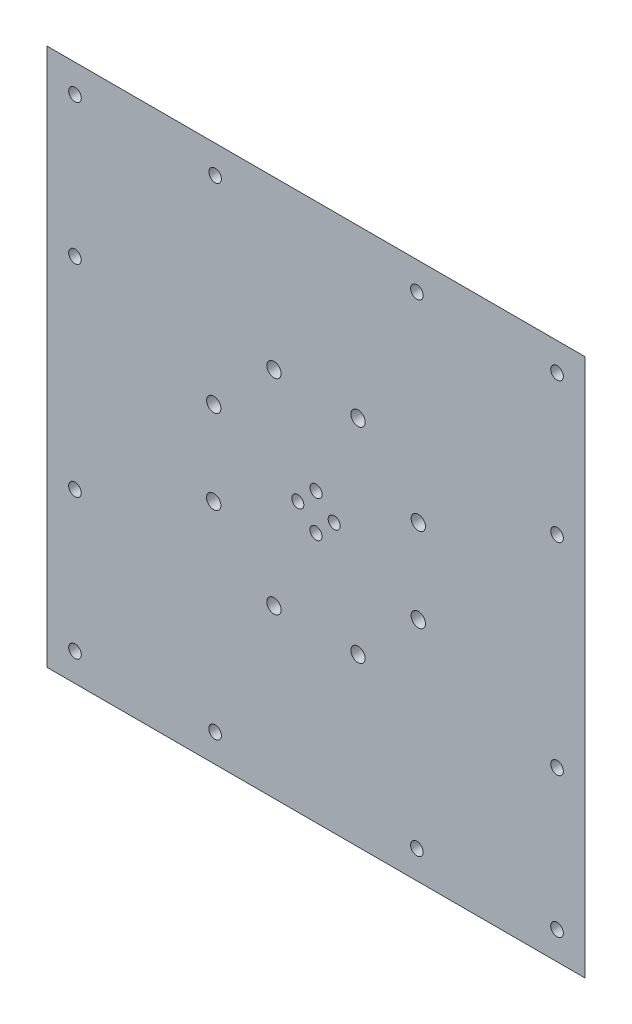
ISO-10303-21;
HEADER;
FILE_DESCRIPTION(('STEP AP214'),'2;1');
FILE_NAME('part.step','',(''),(''),'','','');
FILE_SCHEMA(('AUTOMOTIVE_DESIGN { 1 0 10303 214 1 1 1 1 }'));
ENDSEC;
DATA;
#1=APPLICATION_CONTEXT('core data for automotive mechanical design processes');
#2=APPLICATION_PROTOCOL_DEFINITION('international standard','automotive_design',2000,#1);
#3=PRODUCT_CONTEXT('',#1,'mechanical');
#4=PRODUCT('Part','Part','',(#3));
#5=PRODUCT_RELATED_PRODUCT_CATEGORY('part','',(#4));
#6=PRODUCT_DEFINITION_FORMATION('','',#4);
#7=PRODUCT_DEFINITION_CONTEXT('part definition',#1,'design');
#8=PRODUCT_DEFINITION('design','',#6,#7);
#9=PRODUCT_DEFINITION_SHAPE('','',#8);
#10=(LENGTH_UNIT() NAMED_UNIT(*) SI_UNIT(.MILLI.,.METRE.));
#11=(NAMED_UNIT(*) PLANE_ANGLE_UNIT() SI_UNIT($,.RADIAN.));
#12=(NAMED_UNIT(*) SI_UNIT($,.STERADIAN.) SOLID_ANGLE_UNIT());
#13=UNCERTAINTY_MEASURE_WITH_UNIT(LENGTH_MEASURE(1.E-05),#10,'distance_accuracy_value','');
#14=(GEOMETRIC_REPRESENTATION_CONTEXT(3) GLOBAL_UNCERTAINTY_ASSIGNED_CONTEXT((#13)) GLOBAL_UNIT_ASSIGNED_CONTEXT((#10,
#11,#12)) REPRESENTATION_CONTEXT('',''));
#15=CARTESIAN_POINT('',(0.,0.,0.));
#16=DIRECTION('',(0.,0.,1.));
#17=DIRECTION('',(1.,0.,0.));
#18=AXIS2_PLACEMENT_3D('',#15,#16,#17);
#19=CARTESIAN_POINT('',(0.,0.,0.));
#20=DIRECTION('',(0.,0.,1.));
#21=DIRECTION('',(1.,0.,0.));
#22=AXIS2_PLACEMENT_3D('',#19,#20,#21);
#23=PLANE('',#22);
#24=CARTESIAN_POINT('',(-85.9999999999999,-85.9999999999999,0.));
#25=DIRECTION('',(0.,0.,1.));
#26=DIRECTION('',(1.,0.,0.));
#27=AXIS2_PLACEMENT_3D('',#24,#25,#26);
#28=CIRCLE('',#27,2.24999999999999);
#29=CARTESIAN_POINT('',(-83.7499999999999,-85.9999999999999,0.));
#30=VERTEX_POINT('',#29);
#31=EDGE_CURVE('E641',#30,#30,#28,.T.);
#32=ORIENTED_EDGE('',*,*,#31,.T.);
#33=EDGE_LOOP('',(#32));
#34=FACE_BOUND('',#33,.T.);
#35=CARTESIAN_POINT('',(-85.9999999999999,85.9999999999999,0.));
#36=DIRECTION('',(0.,0.,1.));
#37=DIRECTION('',(1.,0.,0.));
#38=AXIS2_PLACEMENT_3D('',#35,#36,#37);
#39=CIRCLE('',#38,2.24999999999999);
#40=CARTESIAN_POINT('',(-83.7499999999999,85.9999999999999,0.));
#41=VERTEX_POINT('',#40);
#42=EDGE_CURVE('E654',#41,#41,#39,.T.);
#43=ORIENTED_EDGE('',*,*,#42,.T.);
#44=EDGE_LOOP('',(#43));
#45=FACE_BOUND('',#44,.T.);
#46=CARTESIAN_POINT('',(85.9999999999999,85.9999999999999,0.));
#47=DIRECTION('',(0.,0.,1.));
#48=DIRECTION('',(1.,0.,0.));
#49=AXIS2_PLACEMENT_3D('',#46,#47,#48);
#50=CIRCLE('',#49,2.24999999999999);
#51=CARTESIAN_POINT('',(88.2499999999999,85.9999999999999,0.));
#52=VERTEX_POINT('',#51);
#53=EDGE_CURVE('E662',#52,#52,#50,.T.);
#54=ORIENTED_EDGE('',*,*,#53,.T.);
#55=EDGE_LOOP('',(#54));
#56=FACE_BOUND('',#55,.T.);
#57=CARTESIAN_POINT('',(85.9999999999999,-85.9999999999999,0.));
#58=DIRECTION('',(0.,0.,1.));
#59=DIRECTION('',(1.,0.,0.));
#60=AXIS2_PLACEMENT_3D('',#57,#58,#59);
#61=CIRCLE('',#60,2.24999999999999);
#62=CARTESIAN_POINT('',(88.2499999999999,-85.9999999999999,0.));
#63=VERTEX_POINT('',#62);
#64=EDGE_CURVE('E670',#63,#63,#61,.T.);
#65=ORIENTED_EDGE('',*,*,#64,.T.);
#66=EDGE_LOOP('',(#65));
#67=FACE_BOUND('',#66,.T.);
#68=CARTESIAN_POINT('',(-85.9999999999999,-35.9999999999999,0.));
#69=DIRECTION('',(0.,0.,1.));
#70=DIRECTION('',(1.,0.,0.));
#71=AXIS2_PLACEMENT_3D('',#68,#69,#70);
#72=CIRCLE('',#71,2.24999999999999);
#73=CARTESIAN_POINT('',(-83.7499999999999,-35.9999999999999,0.));
#74=VERTEX_POINT('',#73);
#75=EDGE_CURVE('E678',#74,#74,#72,.T.);
#76=ORIENTED_EDGE('',*,*,#75,.T.);
#77=EDGE_LOOP('',(#76));
#78=FACE_BOUND('',#77,.T.);
#79=CARTESIAN_POINT('',(-35.9999999999999,-85.9999999999999,0.));
#80=DIRECTION('',(0.,0.,1.));
#81=DIRECTION('',(1.,0.,0.));
#82=AXIS2_PLACEMENT_3D('',#79,#80,#81);
#83=CIRCLE('',#82,2.24999999999999);
#84=CARTESIAN_POINT('',(-33.7499999999999,-85.9999999999999,0.));
#85=VERTEX_POINT('',#84);
#86=EDGE_CURVE('E686',#85,#85,#83,.T.);
#87=ORIENTED_EDGE('',*,*,#86,.T.);
#88=EDGE_LOOP('',(#87));
#89=FACE_BOUND('',#88,.T.);
#90=CARTESIAN_POINT('',(35.9999999999999,-85.9999999999999,0.));
#91=DIRECTION('',(0.,0.,1.));
#92=DIRECTION('',(1.,0.,0.));
#93=AXIS2_PLACEMENT_3D('',#90,#91,#92);
#94=CIRCLE('',#93,2.24999999999999);
#95=CARTESIAN_POINT('',(38.2499999999999,-85.9999999999999,0.));
#96=VERTEX_POINT('',#95);
#97=EDGE_CURVE('E694',#96,#96,#94,.T.);
#98=ORIENTED_EDGE('',*,*,#97,.T.);
#99=EDGE_LOOP('',(#98));
#100=FACE_BOUND('',#99,.T.);
#101=CARTESIAN_POINT('',(85.9999999999999,-35.9999999999999,0.));
#102=DIRECTION('',(0.,0.,1.));
#103=DIRECTION('',(1.,0.,0.));
#104=AXIS2_PLACEMENT_3D('',#101,#102,#103);
#105=CIRCLE('',#104,2.24999999999999);
#106=CARTESIAN_POINT('',(88.2499999999999,-35.9999999999999,0.));
#107=VERTEX_POINT('',#106);
#108=EDGE_CURVE('E702',#107,#107,#105,.T.);
#109=ORIENTED_EDGE('',*,*,#108,.T.);
#110=EDGE_LOOP('',(#109));
#111=FACE_BOUND('',#110,.T.);
#112=CARTESIAN_POINT('',(85.9999999999999,35.9999999999999,0.));
#113=DIRECTION('',(0.,0.,1.));
#114=DIRECTION('',(1.,0.,0.));
#115=AXIS2_PLACEMENT_3D('',#112,#113,#114);
#116=CIRCLE('',#115,2.24999999999999);
#117=CARTESIAN_POINT('',(88.2499999999999,35.9999999999999,0.));
#118=VERTEX_POINT('',#117);
#119=EDGE_CURVE('E710',#118,#118,#116,.T.);
#120=ORIENTED_EDGE('',*,*,#119,.T.);
#121=EDGE_LOOP('',(#120));
#122=FACE_BOUND('',#121,.T.);
#123=CARTESIAN_POINT('',(-35.9999999999999,85.9999999999999,0.));
#124=DIRECTION('',(0.,0.,1.));
#125=DIRECTION('',(1.,0.,0.));
#126=AXIS2_PLACEMENT_3D('',#123,#124,#125);
#127=CIRCLE('',#126,2.24999999999999);
#128=CARTESIAN_POINT('',(-33.7499999999999,85.9999999999999,0.));
#129=VERTEX_POINT('',#128);
#130=EDGE_CURVE('E718',#129,#129,#127,.T.);
#131=ORIENTED_EDGE('',*,*,#130,.T.);
#132=EDGE_LOOP('',(#131));
#133=FACE_BOUND('',#132,.T.);
#134=CARTESIAN_POINT('',(35.9999999999999,85.9999999999999,0.));
#135=DIRECTION('',(0.,0.,1.));
#136=DIRECTION('',(1.,0.,0.));
#137=AXIS2_PLACEMENT_3D('',#134,#135,#136);
#138=CIRCLE('',#137,2.24999999999999);
#139=CARTESIAN_POINT('',(38.2499999999999,85.9999999999999,0.));
#140=VERTEX_POINT('',#139);
#141=EDGE_CURVE('E726',#140,#140,#138,.T.);
#142=ORIENTED_EDGE('',*,*,#141,.T.);
#143=EDGE_LOOP('',(#142));
#144=FACE_BOUND('',#143,.T.);
#145=CARTESIAN_POINT('',(-85.9999999999999,35.9999999999999,0.));
#146=DIRECTION('',(0.,0.,1.));
#147=DIRECTION('',(1.,0.,0.));
#148=AXIS2_PLACEMENT_3D('',#145,#146,#147);
#149=CIRCLE('',#148,2.24999999999999);
#150=CARTESIAN_POINT('',(-83.7499999999999,35.9999999999999,0.));
#151=VERTEX_POINT('',#150);
#152=EDGE_CURVE('E96',#151,#151,#149,.T.);
#153=ORIENTED_EDGE('',*,*,#152,.T.);
#154=EDGE_LOOP('',(#153));
#155=FACE_BOUND('',#154,.T.);
#156=DIRECTION('',(0.,1.,0.));
#157=VECTOR('',#156,1.);
#158=CARTESIAN_POINT('',(-89.9999999999998,0.,0.));
#159=LINE('',#158,#157);
#160=CARTESIAN_POINT('',(-89.9999999999998,-89.9999999999998,0.));
#161=VERTEX_POINT('',#160);
#162=CARTESIAN_POINT('',(-89.9999999999998,89.9999999999998,0.));
#163=VERTEX_POINT('',#162);
#164=EDGE_CURVE('E111',#161,#163,#159,.T.);
#165=ORIENTED_EDGE('',*,*,#164,.T.);
#166=DIRECTION('',(1.,0.,0.));
#167=VECTOR('',#166,1.);
#168=CARTESIAN_POINT('',(100.,89.9999999999998,0.));
#169=LINE('',#168,#167);
#170=CARTESIAN_POINT('',(89.9999999999998,89.9999999999998,0.));
#171=VERTEX_POINT('',#170);
#172=EDGE_CURVE('E92',#163,#171,#169,.T.);
#173=ORIENTED_EDGE('',*,*,#172,.T.);
#174=DIRECTION('',(0.,-1.,0.));
#175=VECTOR('',#174,1.);
#176=CARTESIAN_POINT('',(89.9999999999999,-100.,0.));
#177=LINE('',#176,#175);
#178=CARTESIAN_POINT('',(89.9999999999999,-89.9999999999998,0.));
#179=VERTEX_POINT('',#178);
#180=EDGE_CURVE('E99',#171,#179,#177,.T.);
#181=ORIENTED_EDGE('',*,*,#180,.T.);
#182=DIRECTION('',(-1.,0.,0.));
#183=VECTOR('',#182,1.);
#184=CARTESIAN_POINT('',(0.,-89.9999999999998,0.));
#185=LINE('',#184,#183);
#186=EDGE_CURVE('E106',#179,#161,#185,.T.);
#187=ORIENTED_EDGE('',*,*,#186,.T.);
#188=EDGE_LOOP('',(#165,#173,#181,#187));
#189=FACE_BOUND('',#188,.T.);
#190=CARTESIAN_POINT('',(0.,6.50000000000001,0.));
#191=DIRECTION('',(0.,0.,1.));
#192=DIRECTION('',(1.,0.,0.));
#193=AXIS2_PLACEMENT_3D('',#190,#191,#192);
#194=CIRCLE('',#193,2.15);
#195=CARTESIAN_POINT('',(2.15,6.50000000000001,0.));
#196=VERTEX_POINT('',#195);
#197=EDGE_CURVE('E154',#196,#196,#194,.T.);
#198=ORIENTED_EDGE('',*,*,#197,.T.);
#199=EDGE_LOOP('',(#198));
#200=FACE_BOUND('',#199,.T.);
#201=CARTESIAN_POINT('',(36.5,-15.,0.));
#202=DIRECTION('',(0.,0.,1.));
#203=DIRECTION('',(1.,0.,0.));
#204=AXIS2_PLACEMENT_3D('',#201,#202,#203);
#205=CIRCLE('',#204,2.55);
#206=CARTESIAN_POINT('',(39.05,-15.,0.));
#207=VERTEX_POINT('',#206);
#208=EDGE_CURVE('E149',#207,#207,#205,.T.);
#209=ORIENTED_EDGE('',*,*,#208,.T.);
#210=EDGE_LOOP('',(#209));
#211=FACE_BOUND('',#210,.T.);
#212=CARTESIAN_POINT('',(36.5,15.,0.));
#213=DIRECTION('',(0.,0.,1.));
#214=DIRECTION('',(1.,0.,0.));
#215=AXIS2_PLACEMENT_3D('',#212,#213,#214);
#216=CIRCLE('',#215,2.55);
#217=CARTESIAN_POINT('',(39.05,15.,0.));
#218=VERTEX_POINT('',#217);
#219=EDGE_CURVE('E145',#218,#218,#216,.T.);
#220=ORIENTED_EDGE('',*,*,#219,.T.);
#221=EDGE_LOOP('',(#220));
#222=FACE_BOUND('',#221,.T.);
#223=CARTESIAN_POINT('',(6.50000000000001,0.,0.));
#224=DIRECTION('',(0.,0.,1.));
#225=DIRECTION('',(1.,0.,0.));
#226=AXIS2_PLACEMENT_3D('',#223,#224,#225);
#227=CIRCLE('',#226,2.15);
#228=CARTESIAN_POINT('',(8.65000000000001,0.,0.));
#229=VERTEX_POINT('',#228);
#230=EDGE_CURVE('E150',#229,#229,#227,.T.);
#231=ORIENTED_EDGE('',*,*,#230,.T.);
#232=EDGE_LOOP('',(#231));
#233=FACE_BOUND('',#232,.T.);
#234=CARTESIAN_POINT('',(-15.,36.5,0.));
#235=DIRECTION('',(0.,0.,1.));
#236=DIRECTION('',(1.,0.,0.));
#237=AXIS2_PLACEMENT_3D('',#234,#235,#236);
#238=CIRCLE('',#237,2.55);
#239=CARTESIAN_POINT('',(-12.45,36.5,0.));
#240=VERTEX_POINT('',#239);
#241=EDGE_CURVE('E158',#240,#240,#238,.T.);
#242=ORIENTED_EDGE('',*,*,#241,.T.);
#243=EDGE_LOOP('',(#242));
#244=FACE_BOUND('',#243,.T.);
#245=CARTESIAN_POINT('',(15.,36.5,0.));
#246=DIRECTION('',(0.,0.,1.));
#247=DIRECTION('',(1.,0.,0.));
#248=AXIS2_PLACEMENT_3D('',#245,#246,#247);
#249=CIRCLE('',#248,2.55);
#250=CARTESIAN_POINT('',(17.55,36.5,0.));
#251=VERTEX_POINT('',#250);
#252=EDGE_CURVE('E171',#251,#251,#249,.T.);
#253=ORIENTED_EDGE('',*,*,#252,.T.);
#254=EDGE_LOOP('',(#253));
#255=FACE_BOUND('',#254,.T.);
#256=CARTESIAN_POINT('',(-6.50000000000001,0.,0.));
#257=DIRECTION('',(0.,0.,1.));
#258=DIRECTION('',(1.,0.,0.));
#259=AXIS2_PLACEMENT_3D('',#256,#257,#258);
#260=CIRCLE('',#259,2.15);
#261=CARTESIAN_POINT('',(-4.35000000000001,0.,0.));
#262=VERTEX_POINT('',#261);
#263=EDGE_CURVE('E167',#262,#262,#260,.T.);
#264=ORIENTED_EDGE('',*,*,#263,.T.);
#265=EDGE_LOOP('',(#264));
#266=FACE_BOUND('',#265,.T.);
#267=CARTESIAN_POINT('',(-36.5,-15.,0.));
#268=DIRECTION('',(0.,0.,1.));
#269=DIRECTION('',(1.,0.,0.));
#270=AXIS2_PLACEMENT_3D('',#267,#268,#269);
#271=CIRCLE('',#270,2.55);
#272=CARTESIAN_POINT('',(-33.95,-15.,0.));
#273=VERTEX_POINT('',#272);
#274=EDGE_CURVE('E162',#273,#273,#271,.T.);
#275=ORIENTED_EDGE('',*,*,#274,.T.);
#276=EDGE_LOOP('',(#275));
#277=FACE_BOUND('',#276,.T.);
#278=CARTESIAN_POINT('',(-15.,-36.5,0.));
#279=DIRECTION('',(0.,0.,1.));
#280=DIRECTION('',(1.,0.,0.));
#281=AXIS2_PLACEMENT_3D('',#278,#279,#280);
#282=CIRCLE('',#281,2.55);
#283=CARTESIAN_POINT('',(-12.45,-36.5,0.));
#284=VERTEX_POINT('',#283);
#285=EDGE_CURVE('E141',#284,#284,#282,.T.);
#286=ORIENTED_EDGE('',*,*,#285,.T.);
#287=EDGE_LOOP('',(#286));
#288=FACE_BOUND('',#287,.T.);
#289=CARTESIAN_POINT('',(15.,-36.5,0.));
#290=DIRECTION('',(0.,0.,1.));
#291=DIRECTION('',(1.,0.,0.));
#292=AXIS2_PLACEMENT_3D('',#289,#290,#291);
#293=CIRCLE('',#292,2.55);
#294=CARTESIAN_POINT('',(17.55,-36.5,0.));
#295=VERTEX_POINT('',#294);
#296=EDGE_CURVE('E135',#295,#295,#293,.T.);
#297=ORIENTED_EDGE('',*,*,#296,.T.);
#298=EDGE_LOOP('',(#297));
#299=FACE_BOUND('',#298,.T.);
#300=CARTESIAN_POINT('',(0.,-6.50000000000001,0.));
#301=DIRECTION('',(0.,0.,1.));
#302=DIRECTION('',(1.,0.,0.));
#303=AXIS2_PLACEMENT_3D('',#300,#301,#302);
#304=CIRCLE('',#303,2.15);
#305=CARTESIAN_POINT('',(2.15,-6.50000000000001,0.));
#306=VERTEX_POINT('',#305);
#307=EDGE_CURVE('E130',#306,#306,#304,.T.);
#308=ORIENTED_EDGE('',*,*,#307,.T.);
#309=EDGE_LOOP('',(#308));
#310=FACE_BOUND('',#309,.T.);
#311=CARTESIAN_POINT('',(-36.5,15.,0.));
#312=DIRECTION('',(0.,0.,1.));
#313=DIRECTION('',(1.,0.,0.));
#314=AXIS2_PLACEMENT_3D('',#311,#312,#313);
#315=CIRCLE('',#314,2.55);
#316=CARTESIAN_POINT('',(-33.95,15.,0.));
#317=VERTEX_POINT('',#316);
#318=EDGE_CURVE('E166',#317,#317,#315,.T.);
#319=ORIENTED_EDGE('',*,*,#318,.T.);
#320=EDGE_LOOP('',(#319));
#321=FACE_BOUND('',#320,.T.);
#322=ADVANCED_FACE('F45',(#34,#45,#56,#67,#78,#89,#100,#111,#122,#133,#144,#155,#189,#200,#211,
#222,#233,#244,#255,#266,#277,#288,#299,#310,#321),#23,.F.);
#323=CARTESIAN_POINT('',(0.,0.,6.));
#324=DIRECTION('',(0.,0.,1.));
#325=DIRECTION('',(1.,0.,0.));
#326=AXIS2_PLACEMENT_3D('',#323,#324,#325);
#327=PLANE('',#326);
#328=CARTESIAN_POINT('',(-85.9999999999999,-85.9999999999999,6.));
#329=DIRECTION('',(0.,0.,1.));
#330=DIRECTION('',(1.,0.,0.));
#331=AXIS2_PLACEMENT_3D('',#328,#329,#330);
#332=CIRCLE('',#331,2.24999999999999);
#333=CARTESIAN_POINT('',(-83.7499999999999,-85.9999999999999,6.));
#334=VERTEX_POINT('',#333);
#335=EDGE_CURVE('E644',#334,#334,#332,.T.);
#336=ORIENTED_EDGE('',*,*,#335,.F.);
#337=EDGE_LOOP('',(#336));
#338=FACE_BOUND('',#337,.T.);
#339=CARTESIAN_POINT('',(-85.9999999999999,85.9999999999999,6.));
#340=DIRECTION('',(0.,0.,1.));
#341=DIRECTION('',(1.,0.,0.));
#342=AXIS2_PLACEMENT_3D('',#339,#340,#341);
#343=CIRCLE('',#342,2.24999999999999);
#344=CARTESIAN_POINT('',(-83.7499999999999,85.9999999999999,6.));
#345=VERTEX_POINT('',#344);
#346=EDGE_CURVE('E648',#345,#345,#343,.T.);
#347=ORIENTED_EDGE('',*,*,#346,.F.);
#348=EDGE_LOOP('',(#347));
#349=FACE_BOUND('',#348,.T.);
#350=CARTESIAN_POINT('',(85.9999999999999,85.9999999999999,6.));
#351=DIRECTION('',(0.,0.,1.));
#352=DIRECTION('',(1.,0.,0.));
#353=AXIS2_PLACEMENT_3D('',#350,#351,#352);
#354=CIRCLE('',#353,2.24999999999999);
#355=CARTESIAN_POINT('',(88.2499999999999,85.9999999999999,6.));
#356=VERTEX_POINT('',#355);
#357=EDGE_CURVE('E658',#356,#356,#354,.T.);
#358=ORIENTED_EDGE('',*,*,#357,.F.);
#359=EDGE_LOOP('',(#358));
#360=FACE_BOUND('',#359,.T.);
#361=CARTESIAN_POINT('',(85.9999999999999,-85.9999999999999,6.));
#362=DIRECTION('',(0.,0.,1.));
#363=DIRECTION('',(1.,0.,0.));
#364=AXIS2_PLACEMENT_3D('',#361,#362,#363);
#365=CIRCLE('',#364,2.24999999999999);
#366=CARTESIAN_POINT('',(88.2499999999999,-85.9999999999999,6.));
#367=VERTEX_POINT('',#366);
#368=EDGE_CURVE('E666',#367,#367,#365,.T.);
#369=ORIENTED_EDGE('',*,*,#368,.F.);
#370=EDGE_LOOP('',(#369));
#371=FACE_BOUND('',#370,.T.);
#372=CARTESIAN_POINT('',(-85.9999999999999,-35.9999999999999,6.));
#373=DIRECTION('',(0.,0.,1.));
#374=DIRECTION('',(1.,0.,0.));
#375=AXIS2_PLACEMENT_3D('',#372,#373,#374);
#376=CIRCLE('',#375,2.24999999999999);
#377=CARTESIAN_POINT('',(-83.7499999999999,-35.9999999999999,6.));
#378=VERTEX_POINT('',#377);
#379=EDGE_CURVE('E674',#378,#378,#376,.T.);
#380=ORIENTED_EDGE('',*,*,#379,.F.);
#381=EDGE_LOOP('',(#380));
#382=FACE_BOUND('',#381,.T.);
#383=CARTESIAN_POINT('',(-35.9999999999999,-85.9999999999999,6.));
#384=DIRECTION('',(0.,0.,1.));
#385=DIRECTION('',(1.,0.,0.));
#386=AXIS2_PLACEMENT_3D('',#383,#384,#385);
#387=CIRCLE('',#386,2.24999999999999);
#388=CARTESIAN_POINT('',(-33.7499999999999,-85.9999999999999,6.));
#389=VERTEX_POINT('',#388);
#390=EDGE_CURVE('E682',#389,#389,#387,.T.);
#391=ORIENTED_EDGE('',*,*,#390,.F.);
#392=EDGE_LOOP('',(#391));
#393=FACE_BOUND('',#392,.T.);
#394=CARTESIAN_POINT('',(35.9999999999999,-85.9999999999999,6.));
#395=DIRECTION('',(0.,0.,1.));
#396=DIRECTION('',(1.,0.,0.));
#397=AXIS2_PLACEMENT_3D('',#394,#395,#396);
#398=CIRCLE('',#397,2.24999999999999);
#399=CARTESIAN_POINT('',(38.2499999999999,-85.9999999999999,6.));
#400=VERTEX_POINT('',#399);
#401=EDGE_CURVE('E690',#400,#400,#398,.T.);
#402=ORIENTED_EDGE('',*,*,#401,.F.);
#403=EDGE_LOOP('',(#402));
#404=FACE_BOUND('',#403,.T.);
#405=CARTESIAN_POINT('',(85.9999999999999,-35.9999999999999,6.));
#406=DIRECTION('',(0.,0.,1.));
#407=DIRECTION('',(1.,0.,0.));
#408=AXIS2_PLACEMENT_3D('',#405,#406,#407);
#409=CIRCLE('',#408,2.24999999999999);
#410=CARTESIAN_POINT('',(88.2499999999999,-35.9999999999999,6.));
#411=VERTEX_POINT('',#410);
#412=EDGE_CURVE('E698',#411,#411,#409,.T.);
#413=ORIENTED_EDGE('',*,*,#412,.F.);
#414=EDGE_LOOP('',(#413));
#415=FACE_BOUND('',#414,.T.);
#416=CARTESIAN_POINT('',(85.9999999999999,35.9999999999999,6.));
#417=DIRECTION('',(0.,0.,1.));
#418=DIRECTION('',(1.,0.,0.));
#419=AXIS2_PLACEMENT_3D('',#416,#417,#418);
#420=CIRCLE('',#419,2.24999999999999);
#421=CARTESIAN_POINT('',(88.2499999999999,35.9999999999999,6.));
#422=VERTEX_POINT('',#421);
#423=EDGE_CURVE('E706',#422,#422,#420,.T.);
#424=ORIENTED_EDGE('',*,*,#423,.F.);
#425=EDGE_LOOP('',(#424));
#426=FACE_BOUND('',#425,.T.);
#427=CARTESIAN_POINT('',(-35.9999999999999,85.9999999999999,6.));
#428=DIRECTION('',(0.,0.,1.));
#429=DIRECTION('',(1.,0.,0.));
#430=AXIS2_PLACEMENT_3D('',#427,#428,#429);
#431=CIRCLE('',#430,2.24999999999999);
#432=CARTESIAN_POINT('',(-33.7499999999999,85.9999999999999,6.));
#433=VERTEX_POINT('',#432);
#434=EDGE_CURVE('E714',#433,#433,#431,.T.);
#435=ORIENTED_EDGE('',*,*,#434,.F.);
#436=EDGE_LOOP('',(#435));
#437=FACE_BOUND('',#436,.T.);
#438=CARTESIAN_POINT('',(35.9999999999999,85.9999999999999,6.));
#439=DIRECTION('',(0.,0.,1.));
#440=DIRECTION('',(1.,0.,0.));
#441=AXIS2_PLACEMENT_3D('',#438,#439,#440);
#442=CIRCLE('',#441,2.24999999999999);
#443=CARTESIAN_POINT('',(38.2499999999999,85.9999999999999,6.));
#444=VERTEX_POINT('',#443);
#445=EDGE_CURVE('E722',#444,#444,#442,.T.);
#446=ORIENTED_EDGE('',*,*,#445,.F.);
#447=EDGE_LOOP('',(#446));
#448=FACE_BOUND('',#447,.T.);
#449=CARTESIAN_POINT('',(-85.9999999999999,35.9999999999999,6.));
#450=DIRECTION('',(0.,0.,1.));
#451=DIRECTION('',(1.,0.,0.));
#452=AXIS2_PLACEMENT_3D('',#449,#450,#451);
#453=CIRCLE('',#452,2.24999999999999);
#454=CARTESIAN_POINT('',(-83.7499999999999,35.9999999999999,6.));
#455=VERTEX_POINT('',#454);
#456=EDGE_CURVE('E730',#455,#455,#453,.T.);
#457=ORIENTED_EDGE('',*,*,#456,.F.);
#458=EDGE_LOOP('',(#457));
#459=FACE_BOUND('',#458,.T.);
#460=DIRECTION('',(0.,1.,0.));
#461=VECTOR('',#460,1.);
#462=CARTESIAN_POINT('',(95.9999999999999,0.,6.));
#463=LINE('',#462,#461);
#464=CARTESIAN_POINT('',(95.9999999999999,-95.9999999999999,6.));
#465=VERTEX_POINT('',#464);
#466=CARTESIAN_POINT('',(95.9999999999999,95.9999999999999,6.));
#467=VERTEX_POINT('',#466);
#468=EDGE_CURVE('E113',#465,#467,#463,.T.);
#469=ORIENTED_EDGE('',*,*,#468,.T.);
#470=DIRECTION('',(-1.,0.,0.));
#471=VECTOR('',#470,1.);
#472=CARTESIAN_POINT('',(0.,95.9999999999999,6.));
#473=LINE('',#472,#471);
#474=CARTESIAN_POINT('',(-95.9999999999999,95.9999999999999,6.));
#475=VERTEX_POINT('',#474);
#476=EDGE_CURVE('E11',#467,#475,#473,.T.);
#477=ORIENTED_EDGE('',*,*,#476,.T.);
#478=DIRECTION('',(0.,1.,0.));
#479=VECTOR('',#478,1.);
#480=CARTESIAN_POINT('',(-95.9999999999999,0.,6.));
#481=LINE('',#480,#479);
#482=CARTESIAN_POINT('',(-95.9999999999999,-95.9999999999999,6.));
#483=VERTEX_POINT('',#482);
#484=EDGE_CURVE('E56',#475,#483,#481,.F.);
#485=ORIENTED_EDGE('',*,*,#484,.T.);
#486=DIRECTION('',(-1.,0.,0.));
#487=VECTOR('',#486,1.);
#488=CARTESIAN_POINT('',(0.,-95.9999999999999,6.));
#489=LINE('',#488,#487);
#490=EDGE_CURVE('E117',#483,#465,#489,.F.);
#491=ORIENTED_EDGE('',*,*,#490,.T.);
#492=EDGE_LOOP('',(#469,#477,#485,#491));
#493=FACE_BOUND('',#492,.T.);
#494=CARTESIAN_POINT('',(0.,6.50000000000001,6.));
#495=DIRECTION('',(0.,0.,1.));
#496=DIRECTION('',(1.,0.,0.));
#497=AXIS2_PLACEMENT_3D('',#494,#495,#496);
#498=CIRCLE('',#497,2.15);
#499=CARTESIAN_POINT('',(2.15,6.50000000000001,6.));
#500=VERTEX_POINT('',#499);
#501=EDGE_CURVE('E107',#500,#500,#498,.F.);
#502=ORIENTED_EDGE('',*,*,#501,.T.);
#503=EDGE_LOOP('',(#502));
#504=FACE_BOUND('',#503,.T.);
#505=CARTESIAN_POINT('',(36.5,-15.,6.));
#506=DIRECTION('',(0.,0.,1.));
#507=DIRECTION('',(1.,0.,0.));
#508=AXIS2_PLACEMENT_3D('',#505,#506,#507);
#509=CIRCLE('',#508,2.55);
#510=CARTESIAN_POINT('',(39.05,-15.,6.));
#511=VERTEX_POINT('',#510);
#512=EDGE_CURVE('E221',#511,#511,#509,.F.);
#513=ORIENTED_EDGE('',*,*,#512,.T.);
#514=EDGE_LOOP('',(#513));
#515=FACE_BOUND('',#514,.T.);
#516=CARTESIAN_POINT('',(36.5,15.,6.));
#517=DIRECTION('',(0.,0.,1.));
#518=DIRECTION('',(1.,0.,0.));
#519=AXIS2_PLACEMENT_3D('',#516,#517,#518);
#520=CIRCLE('',#519,2.55);
#521=CARTESIAN_POINT('',(39.05,15.,6.));
#522=VERTEX_POINT('',#521);
#523=EDGE_CURVE('E217',#522,#522,#520,.F.);
#524=ORIENTED_EDGE('',*,*,#523,.T.);
#525=EDGE_LOOP('',(#524));
#526=FACE_BOUND('',#525,.T.);
#527=CARTESIAN_POINT('',(6.50000000000001,0.,6.));
#528=DIRECTION('',(0.,0.,1.));
#529=DIRECTION('',(1.,0.,0.));
#530=AXIS2_PLACEMENT_3D('',#527,#528,#529);
#531=CIRCLE('',#530,2.15);
#532=CARTESIAN_POINT('',(8.65000000000001,0.,6.));
#533=VERTEX_POINT('',#532);
#534=EDGE_CURVE('E213',#533,#533,#531,.F.);
#535=ORIENTED_EDGE('',*,*,#534,.T.);
#536=EDGE_LOOP('',(#535));
#537=FACE_BOUND('',#536,.T.);
#538=CARTESIAN_POINT('',(-15.,36.5,6.));
#539=DIRECTION('',(0.,0.,1.));
#540=DIRECTION('',(1.,0.,0.));
#541=AXIS2_PLACEMENT_3D('',#538,#539,#540);
#542=CIRCLE('',#541,2.55);
#543=CARTESIAN_POINT('',(-12.45,36.5,6.));
#544=VERTEX_POINT('',#543);
#545=EDGE_CURVE('E209',#544,#544,#542,.F.);
#546=ORIENTED_EDGE('',*,*,#545,.T.);
#547=EDGE_LOOP('',(#546));
#548=FACE_BOUND('',#547,.T.);
#549=CARTESIAN_POINT('',(15.,36.5,6.));
#550=DIRECTION('',(0.,0.,1.));
#551=DIRECTION('',(1.,0.,0.));
#552=AXIS2_PLACEMENT_3D('',#549,#550,#551);
#553=CIRCLE('',#552,2.55);
#554=CARTESIAN_POINT('',(17.55,36.5,6.));
#555=VERTEX_POINT('',#554);
#556=EDGE_CURVE('E205',#555,#555,#553,.F.);
#557=ORIENTED_EDGE('',*,*,#556,.T.);
#558=EDGE_LOOP('',(#557));
#559=FACE_BOUND('',#558,.T.);
#560=CARTESIAN_POINT('',(-6.50000000000001,0.,6.));
#561=DIRECTION('',(0.,0.,1.));
#562=DIRECTION('',(1.,0.,0.));
#563=AXIS2_PLACEMENT_3D('',#560,#561,#562);
#564=CIRCLE('',#563,2.15);
#565=CARTESIAN_POINT('',(-4.35000000000001,0.,6.));
#566=VERTEX_POINT('',#565);
#567=EDGE_CURVE('E201',#566,#566,#564,.F.);
#568=ORIENTED_EDGE('',*,*,#567,.T.);
#569=EDGE_LOOP('',(#568));
#570=FACE_BOUND('',#569,.T.);
#571=CARTESIAN_POINT('',(-36.5,-15.,6.));
#572=DIRECTION('',(0.,0.,1.));
#573=DIRECTION('',(1.,0.,0.));
#574=AXIS2_PLACEMENT_3D('',#571,#572,#573);
#575=CIRCLE('',#574,2.55);
#576=CARTESIAN_POINT('',(-33.95,-15.,6.));
#577=VERTEX_POINT('',#576);
#578=EDGE_CURVE('E197',#577,#577,#575,.F.);
#579=ORIENTED_EDGE('',*,*,#578,.T.);
#580=EDGE_LOOP('',(#579));
#581=FACE_BOUND('',#580,.T.);
#582=CARTESIAN_POINT('',(-15.,-36.5,6.));
#583=DIRECTION('',(0.,0.,1.));
#584=DIRECTION('',(1.,0.,0.));
#585=AXIS2_PLACEMENT_3D('',#582,#583,#584);
#586=CIRCLE('',#585,2.55);
#587=CARTESIAN_POINT('',(-12.45,-36.5,6.));
#588=VERTEX_POINT('',#587);
#589=EDGE_CURVE('E193',#588,#588,#586,.F.);
#590=ORIENTED_EDGE('',*,*,#589,.T.);
#591=EDGE_LOOP('',(#590));
#592=FACE_BOUND('',#591,.T.);
#593=CARTESIAN_POINT('',(15.,-36.5,6.));
#594=DIRECTION('',(0.,0.,1.));
#595=DIRECTION('',(1.,0.,0.));
#596=AXIS2_PLACEMENT_3D('',#593,#594,#595);
#597=CIRCLE('',#596,2.55);
#598=CARTESIAN_POINT('',(17.55,-36.5,6.));
#599=VERTEX_POINT('',#598);
#600=EDGE_CURVE('E189',#599,#599,#597,.F.);
#601=ORIENTED_EDGE('',*,*,#600,.T.);
#602=EDGE_LOOP('',(#601));
#603=FACE_BOUND('',#602,.T.);
#604=CARTESIAN_POINT('',(0.,-6.50000000000001,6.));
#605=DIRECTION('',(0.,0.,1.));
#606=DIRECTION('',(1.,0.,0.));
#607=AXIS2_PLACEMENT_3D('',#604,#605,#606);
#608=CIRCLE('',#607,2.15);
#609=CARTESIAN_POINT('',(2.15,-6.50000000000001,6.));
#610=VERTEX_POINT('',#609);
#611=EDGE_CURVE('E185',#610,#610,#608,.F.);
#612=ORIENTED_EDGE('',*,*,#611,.T.);
#613=EDGE_LOOP('',(#612));
#614=FACE_BOUND('',#613,.T.);
#615=CARTESIAN_POINT('',(-36.5,15.,6.));
#616=DIRECTION('',(0.,0.,1.));
#617=DIRECTION('',(1.,0.,0.));
#618=AXIS2_PLACEMENT_3D('',#615,#616,#617);
#619=CIRCLE('',#618,2.55);
#620=CARTESIAN_POINT('',(-33.95,15.,6.));
#621=VERTEX_POINT('',#620);
#622=EDGE_CURVE('E181',#621,#621,#619,.F.);
#623=ORIENTED_EDGE('',*,*,#622,.T.);
#624=EDGE_LOOP('',(#623));
#625=FACE_BOUND('',#624,.T.);
#626=ADVANCED_FACE('F230',(#338,#349,#360,#371,#382,#393,#404,#415,#426,#437,#448,#459,#493,
#504,#515,#526,#537,#548,#559,#570,#581,#592,#603,#614,#625),#327,.T.);
#627=CARTESIAN_POINT('',(-36.5,15.,10.));
#628=DIRECTION('',(0.,0.,-1.));
#629=DIRECTION('',(-1.,0.,0.));
#630=AXIS2_PLACEMENT_3D('',#627,#628,#629);
#631=CYLINDRICAL_SURFACE('',#630,2.55);
#632=ORIENTED_EDGE('',*,*,#622,.F.);
#633=EDGE_LOOP('',(#632));
#634=FACE_BOUND('',#633,.T.);
#635=ORIENTED_EDGE('',*,*,#318,.F.);
#636=EDGE_LOOP('',(#635));
#637=FACE_BOUND('',#636,.T.);
#638=ADVANCED_FACE('F233',(#634,#637),#631,.F.);
#639=CARTESIAN_POINT('',(0.,-6.50000000000001,10.));
#640=DIRECTION('',(0.,0.,-1.));
#641=DIRECTION('',(-1.,0.,0.));
#642=AXIS2_PLACEMENT_3D('',#639,#640,#641);
#643=CYLINDRICAL_SURFACE('',#642,2.15);
#644=ORIENTED_EDGE('',*,*,#611,.F.);
#645=EDGE_LOOP('',(#644));
#646=FACE_BOUND('',#645,.T.);
#647=ORIENTED_EDGE('',*,*,#307,.F.);
#648=EDGE_LOOP('',(#647));
#649=FACE_BOUND('',#648,.T.);
#650=ADVANCED_FACE('F262',(#646,#649),#643,.F.);
#651=CARTESIAN_POINT('',(15.,-36.5,10.));
#652=DIRECTION('',(0.,0.,-1.));
#653=DIRECTION('',(-1.,0.,0.));
#654=AXIS2_PLACEMENT_3D('',#651,#652,#653);
#655=CYLINDRICAL_SURFACE('',#654,2.55);
#656=ORIENTED_EDGE('',*,*,#600,.F.);
#657=EDGE_LOOP('',(#656));
#658=FACE_BOUND('',#657,.T.);
#659=ORIENTED_EDGE('',*,*,#296,.F.);
#660=EDGE_LOOP('',(#659));
#661=FACE_BOUND('',#660,.T.);
#662=ADVANCED_FACE('F344',(#658,#661),#655,.F.);
#663=CARTESIAN_POINT('',(-15.,-36.5,10.));
#664=DIRECTION('',(0.,0.,-1.));
#665=DIRECTION('',(-1.,0.,0.));
#666=AXIS2_PLACEMENT_3D('',#663,#664,#665);
#667=CYLINDRICAL_SURFACE('',#666,2.55);
#668=ORIENTED_EDGE('',*,*,#589,.F.);
#669=EDGE_LOOP('',(#668));
#670=FACE_BOUND('',#669,.T.);
#671=ORIENTED_EDGE('',*,*,#285,.F.);
#672=EDGE_LOOP('',(#671));
#673=FACE_BOUND('',#672,.T.);
#674=ADVANCED_FACE('F313',(#670,#673),#667,.F.);
#675=CARTESIAN_POINT('',(-36.5,-15.,10.));
#676=DIRECTION('',(0.,0.,-1.));
#677=DIRECTION('',(-1.,0.,0.));
#678=AXIS2_PLACEMENT_3D('',#675,#676,#677);
#679=CYLINDRICAL_SURFACE('',#678,2.55);
#680=ORIENTED_EDGE('',*,*,#578,.F.);
#681=EDGE_LOOP('',(#680));
#682=FACE_BOUND('',#681,.T.);
#683=ORIENTED_EDGE('',*,*,#274,.F.);
#684=EDGE_LOOP('',(#683));
#685=FACE_BOUND('',#684,.T.);
#686=ADVANCED_FACE('F309',(#682,#685),#679,.F.);
#687=CARTESIAN_POINT('',(-6.50000000000001,0.,10.));
#688=DIRECTION('',(0.,0.,-1.));
#689=DIRECTION('',(-1.,0.,0.));
#690=AXIS2_PLACEMENT_3D('',#687,#688,#689);
#691=CYLINDRICAL_SURFACE('',#690,2.15);
#692=ORIENTED_EDGE('',*,*,#567,.F.);
#693=EDGE_LOOP('',(#692));
#694=FACE_BOUND('',#693,.T.);
#695=ORIENTED_EDGE('',*,*,#263,.F.);
#696=EDGE_LOOP('',(#695));
#697=FACE_BOUND('',#696,.T.);
#698=ADVANCED_FACE('F312',(#694,#697),#691,.F.);
#699=CARTESIAN_POINT('',(15.,36.5,10.));
#700=DIRECTION('',(0.,0.,-1.));
#701=DIRECTION('',(-1.,0.,0.));
#702=AXIS2_PLACEMENT_3D('',#699,#700,#701);
#703=CYLINDRICAL_SURFACE('',#702,2.55);
#704=ORIENTED_EDGE('',*,*,#556,.F.);
#705=EDGE_LOOP('',(#704));
#706=FACE_BOUND('',#705,.T.);
#707=ORIENTED_EDGE('',*,*,#252,.F.);
#708=EDGE_LOOP('',(#707));
#709=FACE_BOUND('',#708,.T.);
#710=ADVANCED_FACE('F317',(#706,#709),#703,.F.);
#711=CARTESIAN_POINT('',(-15.,36.5,10.));
#712=DIRECTION('',(0.,0.,-1.));
#713=DIRECTION('',(-1.,0.,0.));
#714=AXIS2_PLACEMENT_3D('',#711,#712,#713);
#715=CYLINDRICAL_SURFACE('',#714,2.55);
#716=ORIENTED_EDGE('',*,*,#545,.F.);
#717=EDGE_LOOP('',(#716));
#718=FACE_BOUND('',#717,.T.);
#719=ORIENTED_EDGE('',*,*,#241,.F.);
#720=EDGE_LOOP('',(#719));
#721=FACE_BOUND('',#720,.T.);
#722=ADVANCED_FACE('F321',(#718,#721),#715,.F.);
#723=CARTESIAN_POINT('',(6.50000000000001,0.,10.));
#724=DIRECTION('',(0.,0.,-1.));
#725=DIRECTION('',(-1.,0.,0.));
#726=AXIS2_PLACEMENT_3D('',#723,#724,#725);
#727=CYLINDRICAL_SURFACE('',#726,2.15);
#728=ORIENTED_EDGE('',*,*,#534,.F.);
#729=EDGE_LOOP('',(#728));
#730=FACE_BOUND('',#729,.T.);
#731=ORIENTED_EDGE('',*,*,#230,.F.);
#732=EDGE_LOOP('',(#731));
#733=FACE_BOUND('',#732,.T.);
#734=ADVANCED_FACE('F306',(#730,#733),#727,.F.);
#735=CARTESIAN_POINT('',(36.5,15.,10.));
#736=DIRECTION('',(0.,0.,-1.));
#737=DIRECTION('',(-1.,0.,0.));
#738=AXIS2_PLACEMENT_3D('',#735,#736,#737);
#739=CYLINDRICAL_SURFACE('',#738,2.55);
#740=ORIENTED_EDGE('',*,*,#523,.F.);
#741=EDGE_LOOP('',(#740));
#742=FACE_BOUND('',#741,.T.);
#743=ORIENTED_EDGE('',*,*,#219,.F.);
#744=EDGE_LOOP('',(#743));
#745=FACE_BOUND('',#744,.T.);
#746=ADVANCED_FACE('F301',(#742,#745),#739,.F.);
#747=CARTESIAN_POINT('',(36.5,-15.,10.));
#748=DIRECTION('',(0.,0.,-1.));
#749=DIRECTION('',(-1.,0.,0.));
#750=AXIS2_PLACEMENT_3D('',#747,#748,#749);
#751=CYLINDRICAL_SURFACE('',#750,2.55);
#752=ORIENTED_EDGE('',*,*,#512,.F.);
#753=EDGE_LOOP('',(#752));
#754=FACE_BOUND('',#753,.T.);
#755=ORIENTED_EDGE('',*,*,#208,.F.);
#756=EDGE_LOOP('',(#755));
#757=FACE_BOUND('',#756,.T.);
#758=ADVANCED_FACE('F295',(#754,#757),#751,.F.);
#759=CARTESIAN_POINT('',(0.,6.50000000000001,10.));
#760=DIRECTION('',(0.,0.,-1.));
#761=DIRECTION('',(-1.,0.,0.));
#762=AXIS2_PLACEMENT_3D('',#759,#760,#761);
#763=CYLINDRICAL_SURFACE('',#762,2.15);
#764=ORIENTED_EDGE('',*,*,#501,.F.);
#765=EDGE_LOOP('',(#764));
#766=FACE_BOUND('',#765,.T.);
#767=ORIENTED_EDGE('',*,*,#197,.F.);
#768=EDGE_LOOP('',(#767));
#769=FACE_BOUND('',#768,.T.);
#770=ADVANCED_FACE('F291',(#766,#769),#763,.F.);
#771=CARTESIAN_POINT('',(-100.,-100.,10.0000000000001));
#772=DIRECTION('',(0.,0.707106781186544,0.707106781186551));
#773=DIRECTION('',(1.,0.,0.));
#774=AXIS2_PLACEMENT_3D('',#771,#772,#773);
#775=PLANE('',#774);
#776=DIRECTION('',(0.577350269189628,-0.577350269189628,0.577350269189622));
#777=VECTOR('',#776,1.);
#778=CARTESIAN_POINT('',(59.9999999999997,-59.9999999999997,-29.9999999999998));
#779=LINE('',#778,#777);
#780=EDGE_CURVE('E102',#465,#179,#779,.F.);
#781=ORIENTED_EDGE('',*,*,#780,.F.);
#782=ORIENTED_EDGE('',*,*,#490,.F.);
#783=DIRECTION('',(0.577350269189628,0.577350269189628,-0.577350269189622));
#784=VECTOR('',#783,1.);
#785=CARTESIAN_POINT('',(-100.,-100.,10.0000000000001));
#786=LINE('',#785,#784);
#787=EDGE_CURVE('E50',#161,#483,#786,.F.);
#788=ORIENTED_EDGE('',*,*,#787,.F.);
#789=ORIENTED_EDGE('',*,*,#186,.F.);
#790=EDGE_LOOP('',(#781,#782,#788,#789));
#791=FACE_BOUND('',#790,.T.);
#792=ADVANCED_FACE('F48',(#791),#775,.F.);
#793=CARTESIAN_POINT('',(-100.,100.,10.0000000000001));
#794=DIRECTION('',(0.707106781186544,0.,0.707106781186551));
#795=DIRECTION('',(0.,-1.,0.));
#796=AXIS2_PLACEMENT_3D('',#793,#794,#795);
#797=PLANE('',#796);
#798=ORIENTED_EDGE('',*,*,#787,.T.);
#799=ORIENTED_EDGE('',*,*,#484,.F.);
#800=DIRECTION('',(-0.577350269189628,0.577350269189628,0.577350269189622));
#801=VECTOR('',#800,1.);
#802=CARTESIAN_POINT('',(-100.,100.,10.0000000000001));
#803=LINE('',#802,#801);
#804=EDGE_CURVE('E64',#163,#475,#803,.T.);
#805=ORIENTED_EDGE('',*,*,#804,.F.);
#806=ORIENTED_EDGE('',*,*,#164,.F.);
#807=EDGE_LOOP('',(#798,#799,#805,#806));
#808=FACE_BOUND('',#807,.T.);
#809=ADVANCED_FACE('F229',(#808),#797,.F.);
#810=CARTESIAN_POINT('',(89.9999999999998,0.,0.));
#811=DIRECTION('',(0.707106781186544,0.,-0.707106781186551));
#812=DIRECTION('',(0.,1.,0.));
#813=AXIS2_PLACEMENT_3D('',#810,#811,#812);
#814=PLANE('',#813);
#815=ORIENTED_EDGE('',*,*,#780,.T.);
#816=ORIENTED_EDGE('',*,*,#180,.F.);
#817=DIRECTION('',(0.577350269189628,0.577350269189628,0.577350269189622));
#818=VECTOR('',#817,1.);
#819=CARTESIAN_POINT('',(59.9999999999997,59.9999999999997,-29.9999999999998));
#820=LINE('',#819,#818);
#821=EDGE_CURVE('E88',#467,#171,#820,.F.);
#822=ORIENTED_EDGE('',*,*,#821,.F.);
#823=ORIENTED_EDGE('',*,*,#468,.F.);
#824=EDGE_LOOP('',(#815,#816,#822,#823));
#825=FACE_BOUND('',#824,.T.);
#826=ADVANCED_FACE('F100',(#825),#814,.T.);
#827=CARTESIAN_POINT('',(0.,89.9999999999998,0.));
#828=DIRECTION('',(0.,0.707106781186544,-0.707106781186551));
#829=DIRECTION('',(-1.,0.,0.));
#830=AXIS2_PLACEMENT_3D('',#827,#828,#829);
#831=PLANE('',#830);
#832=ORIENTED_EDGE('',*,*,#804,.T.);
#833=ORIENTED_EDGE('',*,*,#476,.F.);
#834=ORIENTED_EDGE('',*,*,#821,.T.);
#835=ORIENTED_EDGE('',*,*,#172,.F.);
#836=EDGE_LOOP('',(#832,#833,#834,#835));
#837=FACE_BOUND('',#836,.T.);
#838=ADVANCED_FACE('F90',(#837),#831,.T.);
#839=CARTESIAN_POINT('',(-85.9999999999999,35.9999999999999,6.));
#840=DIRECTION('',(0.,0.,1.));
#841=DIRECTION('',(1.,0.,0.));
#842=AXIS2_PLACEMENT_3D('',#839,#840,#841);
#843=CYLINDRICAL_SURFACE('',#842,2.24999999999999);
#844=ORIENTED_EDGE('',*,*,#152,.F.);
#845=EDGE_LOOP('',(#844));
#846=FACE_BOUND('',#845,.T.);
#847=ORIENTED_EDGE('',*,*,#456,.T.);
#848=EDGE_LOOP('',(#847));
#849=FACE_BOUND('',#848,.T.);
#850=ADVANCED_FACE('F280',(#846,#849),#843,.F.);
#851=CARTESIAN_POINT('',(35.9999999999999,85.9999999999999,6.));
#852=DIRECTION('',(0.,0.,1.));
#853=DIRECTION('',(1.,0.,0.));
#854=AXIS2_PLACEMENT_3D('',#851,#852,#853);
#855=CYLINDRICAL_SURFACE('',#854,2.24999999999999);
#856=ORIENTED_EDGE('',*,*,#141,.F.);
#857=EDGE_LOOP('',(#856));
#858=FACE_BOUND('',#857,.T.);
#859=ORIENTED_EDGE('',*,*,#445,.T.);
#860=EDGE_LOOP('',(#859));
#861=FACE_BOUND('',#860,.T.);
#862=ADVANCED_FACE('F425',(#858,#861),#855,.F.);
#863=CARTESIAN_POINT('',(-35.9999999999999,85.9999999999999,6.));
#864=DIRECTION('',(0.,0.,1.));
#865=DIRECTION('',(1.,0.,0.));
#866=AXIS2_PLACEMENT_3D('',#863,#864,#865);
#867=CYLINDRICAL_SURFACE('',#866,2.24999999999999);
#868=ORIENTED_EDGE('',*,*,#130,.F.);
#869=EDGE_LOOP('',(#868));
#870=FACE_BOUND('',#869,.T.);
#871=ORIENTED_EDGE('',*,*,#434,.T.);
#872=EDGE_LOOP('',(#871));
#873=FACE_BOUND('',#872,.T.);
#874=ADVANCED_FACE('F435',(#870,#873),#867,.F.);
#875=CARTESIAN_POINT('',(85.9999999999999,35.9999999999999,6.));
#876=DIRECTION('',(0.,0.,1.));
#877=DIRECTION('',(1.,0.,0.));
#878=AXIS2_PLACEMENT_3D('',#875,#876,#877);
#879=CYLINDRICAL_SURFACE('',#878,2.24999999999999);
#880=ORIENTED_EDGE('',*,*,#119,.F.);
#881=EDGE_LOOP('',(#880));
#882=FACE_BOUND('',#881,.T.);
#883=ORIENTED_EDGE('',*,*,#423,.T.);
#884=EDGE_LOOP('',(#883));
#885=FACE_BOUND('',#884,.T.);
#886=ADVANCED_FACE('F446',(#882,#885),#879,.F.);
#887=CARTESIAN_POINT('',(85.9999999999999,-35.9999999999999,6.));
#888=DIRECTION('',(0.,0.,1.));
#889=DIRECTION('',(1.,0.,0.));
#890=AXIS2_PLACEMENT_3D('',#887,#888,#889);
#891=CYLINDRICAL_SURFACE('',#890,2.24999999999999);
#892=ORIENTED_EDGE('',*,*,#108,.F.);
#893=EDGE_LOOP('',(#892));
#894=FACE_BOUND('',#893,.T.);
#895=ORIENTED_EDGE('',*,*,#412,.T.);
#896=EDGE_LOOP('',(#895));
#897=FACE_BOUND('',#896,.T.);
#898=ADVANCED_FACE('F457',(#894,#897),#891,.F.);
#899=CARTESIAN_POINT('',(35.9999999999999,-85.9999999999999,6.));
#900=DIRECTION('',(0.,0.,1.));
#901=DIRECTION('',(1.,0.,0.));
#902=AXIS2_PLACEMENT_3D('',#899,#900,#901);
#903=CYLINDRICAL_SURFACE('',#902,2.24999999999999);
#904=ORIENTED_EDGE('',*,*,#97,.F.);
#905=EDGE_LOOP('',(#904));
#906=FACE_BOUND('',#905,.T.);
#907=ORIENTED_EDGE('',*,*,#401,.T.);
#908=EDGE_LOOP('',(#907));
#909=FACE_BOUND('',#908,.T.);
#910=ADVANCED_FACE('F468',(#906,#909),#903,.F.);
#911=CARTESIAN_POINT('',(-35.9999999999999,-85.9999999999999,6.));
#912=DIRECTION('',(0.,0.,1.));
#913=DIRECTION('',(1.,0.,0.));
#914=AXIS2_PLACEMENT_3D('',#911,#912,#913);
#915=CYLINDRICAL_SURFACE('',#914,2.24999999999999);
#916=ORIENTED_EDGE('',*,*,#86,.F.);
#917=EDGE_LOOP('',(#916));
#918=FACE_BOUND('',#917,.T.);
#919=ORIENTED_EDGE('',*,*,#390,.T.);
#920=EDGE_LOOP('',(#919));
#921=FACE_BOUND('',#920,.T.);
#922=ADVANCED_FACE('F479',(#918,#921),#915,.F.);
#923=CARTESIAN_POINT('',(-85.9999999999999,-35.9999999999999,6.));
#924=DIRECTION('',(0.,0.,1.));
#925=DIRECTION('',(1.,0.,0.));
#926=AXIS2_PLACEMENT_3D('',#923,#924,#925);
#927=CYLINDRICAL_SURFACE('',#926,2.24999999999999);
#928=ORIENTED_EDGE('',*,*,#75,.F.);
#929=EDGE_LOOP('',(#928));
#930=FACE_BOUND('',#929,.T.);
#931=ORIENTED_EDGE('',*,*,#379,.T.);
#932=EDGE_LOOP('',(#931));
#933=FACE_BOUND('',#932,.T.);
#934=ADVANCED_FACE('F490',(#930,#933),#927,.F.);
#935=CARTESIAN_POINT('',(85.9999999999999,-85.9999999999999,6.));
#936=DIRECTION('',(0.,0.,1.));
#937=DIRECTION('',(1.,0.,0.));
#938=AXIS2_PLACEMENT_3D('',#935,#936,#937);
#939=CYLINDRICAL_SURFACE('',#938,2.24999999999999);
#940=ORIENTED_EDGE('',*,*,#64,.F.);
#941=EDGE_LOOP('',(#940));
#942=FACE_BOUND('',#941,.T.);
#943=ORIENTED_EDGE('',*,*,#368,.T.);
#944=EDGE_LOOP('',(#943));
#945=FACE_BOUND('',#944,.T.);
#946=ADVANCED_FACE('F501',(#942,#945),#939,.F.);
#947=CARTESIAN_POINT('',(85.9999999999999,85.9999999999999,6.));
#948=DIRECTION('',(0.,0.,1.));
#949=DIRECTION('',(1.,0.,0.));
#950=AXIS2_PLACEMENT_3D('',#947,#948,#949);
#951=CYLINDRICAL_SURFACE('',#950,2.24999999999999);
#952=ORIENTED_EDGE('',*,*,#53,.F.);
#953=EDGE_LOOP('',(#952));
#954=FACE_BOUND('',#953,.T.);
#955=ORIENTED_EDGE('',*,*,#357,.T.);
#956=EDGE_LOOP('',(#955));
#957=FACE_BOUND('',#956,.T.);
#958=ADVANCED_FACE('F512',(#954,#957),#951,.F.);
#959=CARTESIAN_POINT('',(-85.9999999999999,85.9999999999999,6.));
#960=DIRECTION('',(0.,0.,1.));
#961=DIRECTION('',(1.,0.,0.));
#962=AXIS2_PLACEMENT_3D('',#959,#960,#961);
#963=CYLINDRICAL_SURFACE('',#962,2.24999999999999);
#964=ORIENTED_EDGE('',*,*,#42,.F.);
#965=EDGE_LOOP('',(#964));
#966=FACE_BOUND('',#965,.T.);
#967=ORIENTED_EDGE('',*,*,#346,.T.);
#968=EDGE_LOOP('',(#967));
#969=FACE_BOUND('',#968,.T.);
#970=ADVANCED_FACE('F523',(#966,#969),#963,.F.);
#971=CARTESIAN_POINT('',(-85.9999999999999,-85.9999999999999,6.));
#972=DIRECTION('',(0.,0.,1.));
#973=DIRECTION('',(1.,0.,0.));
#974=AXIS2_PLACEMENT_3D('',#971,#972,#973);
#975=CYLINDRICAL_SURFACE('',#974,2.24999999999999);
#976=ORIENTED_EDGE('',*,*,#31,.F.);
#977=EDGE_LOOP('',(#976));
#978=FACE_BOUND('',#977,.T.);
#979=ORIENTED_EDGE('',*,*,#335,.T.);
#980=EDGE_LOOP('',(#979));
#981=FACE_BOUND('',#980,.T.);
#982=ADVANCED_FACE('F534',(#978,#981),#975,.F.);
#983=CLOSED_SHELL('',(#322,#626,#638,#650,#662,#674,#686,#698,#710,#722,#734,#746,#758,#770,
#792,#809,#826,#838,#850,#862,#874,#886,#898,#910,#922,#934,#946,#958,#970,#982));
#984=MANIFOLD_SOLID_BREP('B2',#983);
#985=ADVANCED_BREP_SHAPE_REPRESENTATION('',(#18,#984),#14);
#986=SHAPE_DEFINITION_REPRESENTATION(#9,#985);
ENDSEC;
END-ISO-10303-21;
